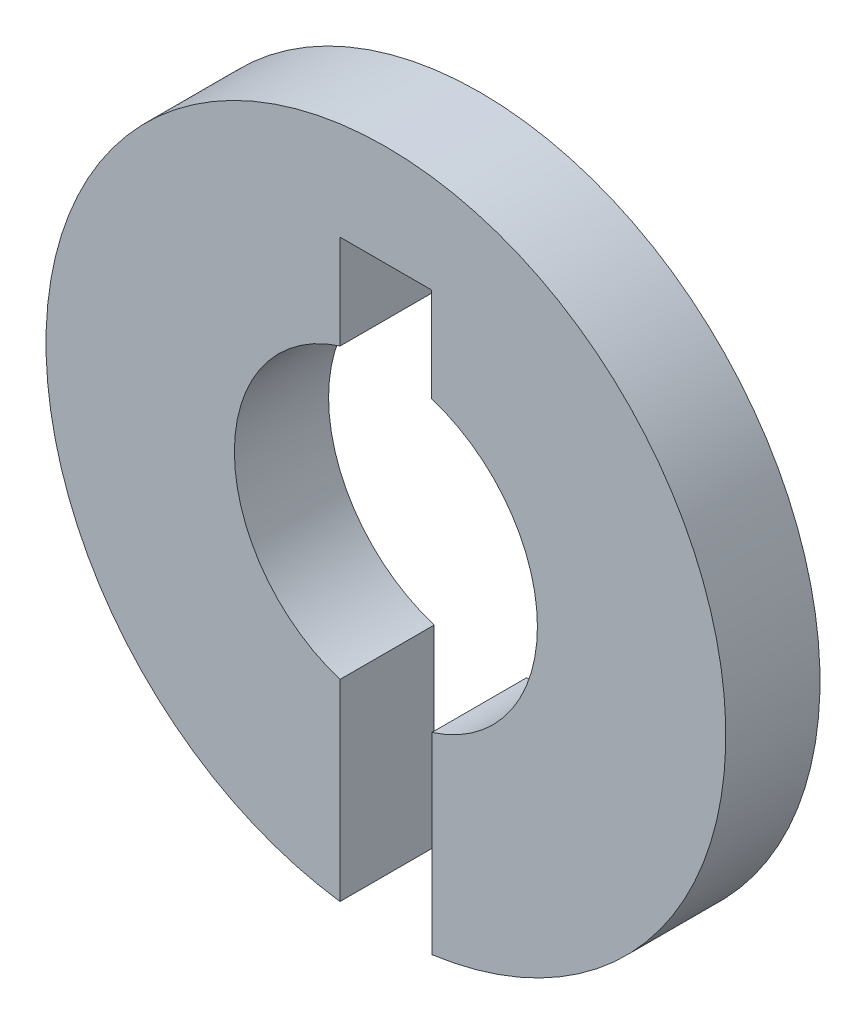
ISO-10303-21;
HEADER;
FILE_DESCRIPTION(('STEP AP214'),'2;1');
FILE_NAME('part.step','',(''),(''),'','','');
FILE_SCHEMA(('AUTOMOTIVE_DESIGN { 1 0 10303 214 1 1 1 1 }'));
ENDSEC;
DATA;
#1=APPLICATION_CONTEXT('core data for automotive mechanical design processes');
#2=APPLICATION_PROTOCOL_DEFINITION('international standard','automotive_design',2000,#1);
#3=PRODUCT_CONTEXT('',#1,'mechanical');
#4=PRODUCT('Part','Part','',(#3));
#5=PRODUCT_RELATED_PRODUCT_CATEGORY('part','',(#4));
#6=PRODUCT_DEFINITION_FORMATION('','',#4);
#7=PRODUCT_DEFINITION_CONTEXT('part definition',#1,'design');
#8=PRODUCT_DEFINITION('design','',#6,#7);
#9=PRODUCT_DEFINITION_SHAPE('','',#8);
#10=(LENGTH_UNIT() NAMED_UNIT(*) SI_UNIT(.MILLI.,.METRE.));
#11=(NAMED_UNIT(*) PLANE_ANGLE_UNIT() SI_UNIT($,.RADIAN.));
#12=(NAMED_UNIT(*) SI_UNIT($,.STERADIAN.) SOLID_ANGLE_UNIT());
#13=UNCERTAINTY_MEASURE_WITH_UNIT(LENGTH_MEASURE(1.E-05),#10,'distance_accuracy_value','');
#14=(GEOMETRIC_REPRESENTATION_CONTEXT(3) GLOBAL_UNCERTAINTY_ASSIGNED_CONTEXT((#13)) GLOBAL_UNIT_ASSIGNED_CONTEXT((#10,
#11,#12)) REPRESENTATION_CONTEXT('',''));
#15=CARTESIAN_POINT('',(0.,0.,0.));
#16=DIRECTION('',(0.,0.,1.));
#17=DIRECTION('',(1.,0.,0.));
#18=AXIS2_PLACEMENT_3D('',#15,#16,#17);
#19=CARTESIAN_POINT('',(0.,0.,3.));
#20=DIRECTION('',(0.,0.,-1.));
#21=DIRECTION('',(-1.,0.,0.));
#22=AXIS2_PLACEMENT_3D('',#19,#20,#21);
#23=CYLINDRICAL_SURFACE('',#22,4.826);
#24=CARTESIAN_POINT('',(0.,0.,0.));
#25=DIRECTION('',(0.,0.,-1.));
#26=DIRECTION('',(1.,0.,0.));
#27=AXIS2_PLACEMENT_3D('',#24,#25,#26);
#28=CIRCLE('',#27,4.826);
#29=CARTESIAN_POINT('',(1.455,4.60144010066414,0.));
#30=VERTEX_POINT('',#29);
#31=CARTESIAN_POINT('',(1.4625,-4.59906183367869,0.));
#32=VERTEX_POINT('',#31);
#33=EDGE_CURVE('E201',#30,#32,#28,.T.);
#34=ORIENTED_EDGE('',*,*,#33,.T.);
#35=DIRECTION('',(0.,0.,-1.));
#36=VECTOR('',#35,1.);
#37=CARTESIAN_POINT('',(1.4625,-4.59906183367869,3.));
#38=LINE('',#37,#36);
#39=CARTESIAN_POINT('',(1.4625,-4.59906183367869,3.));
#40=VERTEX_POINT('',#39);
#41=EDGE_CURVE('E12',#40,#32,#38,.T.);
#42=ORIENTED_EDGE('',*,*,#41,.F.);
#43=CARTESIAN_POINT('',(0.,0.,3.));
#44=DIRECTION('',(0.,0.,-1.));
#45=DIRECTION('',(1.,0.,0.));
#46=AXIS2_PLACEMENT_3D('',#43,#44,#45);
#47=CIRCLE('',#46,4.826);
#48=CARTESIAN_POINT('',(1.455,4.60144010066414,3.));
#49=VERTEX_POINT('',#48);
#50=EDGE_CURVE('E166',#49,#40,#47,.T.);
#51=ORIENTED_EDGE('',*,*,#50,.F.);
#52=DIRECTION('',(0.,0.,-1.));
#53=VECTOR('',#52,1.);
#54=CARTESIAN_POINT('',(1.455,4.60144010066414,3.));
#55=LINE('',#54,#53);
#56=EDGE_CURVE('E141',#49,#30,#55,.T.);
#57=ORIENTED_EDGE('',*,*,#56,.T.);
#58=EDGE_LOOP('',(#34,#42,#51,#57));
#59=FACE_BOUND('',#58,.T.);
#60=ADVANCED_FACE('F46',(#59),#23,.F.);
#61=CARTESIAN_POINT('',(1.4625,-10.7267595176735,3.));
#62=DIRECTION('',(1.,0.,0.));
#63=DIRECTION('',(0.,0.,-1.));
#64=AXIS2_PLACEMENT_3D('',#61,#62,#63);
#65=PLANE('',#64);
#66=DIRECTION('',(0.,-1.,0.));
#67=VECTOR('',#66,1.);
#68=CARTESIAN_POINT('',(1.4625,-10.7267595176735,0.));
#69=LINE('',#68,#67);
#70=CARTESIAN_POINT('',(1.4625,-10.7267595176735,0.));
#71=VERTEX_POINT('',#70);
#72=EDGE_CURVE('E195',#32,#71,#69,.T.);
#73=ORIENTED_EDGE('',*,*,#72,.T.);
#74=DIRECTION('',(0.,0.,-1.));
#75=VECTOR('',#74,1.);
#76=CARTESIAN_POINT('',(1.4625,-10.7267595176735,3.));
#77=LINE('',#76,#75);
#78=CARTESIAN_POINT('',(1.4625,-10.7267595176735,3.));
#79=VERTEX_POINT('',#78);
#80=EDGE_CURVE('E54',#79,#71,#77,.T.);
#81=ORIENTED_EDGE('',*,*,#80,.F.);
#82=DIRECTION('',(0.,-1.,0.));
#83=VECTOR('',#82,1.);
#84=CARTESIAN_POINT('',(1.4625,-10.7267595176735,3.));
#85=LINE('',#84,#83);
#86=EDGE_CURVE('E105',#40,#79,#85,.T.);
#87=ORIENTED_EDGE('',*,*,#86,.F.);
#88=ORIENTED_EDGE('',*,*,#41,.T.);
#89=EDGE_LOOP('',(#73,#81,#87,#88));
#90=FACE_BOUND('',#89,.T.);
#91=ADVANCED_FACE('F220',(#90),#65,.F.);
#92=CARTESIAN_POINT('',(0.,0.,3.));
#93=DIRECTION('',(0.,0.,-1.));
#94=DIRECTION('',(-1.,0.,0.));
#95=AXIS2_PLACEMENT_3D('',#92,#93,#94);
#96=CYLINDRICAL_SURFACE('',#95,10.826);
#97=CARTESIAN_POINT('',(0.,0.,0.));
#98=DIRECTION('',(0.,0.,1.));
#99=DIRECTION('',(-1.,0.,0.));
#100=AXIS2_PLACEMENT_3D('',#97,#98,#99);
#101=CIRCLE('',#100,10.826);
#102=CARTESIAN_POINT('',(-1.4625,-10.7267595176735,0.));
#103=VERTEX_POINT('',#102);
#104=EDGE_CURVE('E190',#71,#103,#101,.T.);
#105=ORIENTED_EDGE('',*,*,#104,.T.);
#106=DIRECTION('',(0.,0.,-1.));
#107=VECTOR('',#106,1.);
#108=CARTESIAN_POINT('',(-1.4625,-10.7267595176735,3.));
#109=LINE('',#108,#107);
#110=CARTESIAN_POINT('',(-1.4625,-10.7267595176735,3.));
#111=VERTEX_POINT('',#110);
#112=EDGE_CURVE('E182',#111,#103,#109,.T.);
#113=ORIENTED_EDGE('',*,*,#112,.F.);
#114=CARTESIAN_POINT('',(0.,0.,3.));
#115=DIRECTION('',(0.,0.,1.));
#116=DIRECTION('',(-1.,0.,0.));
#117=AXIS2_PLACEMENT_3D('',#114,#115,#116);
#118=CIRCLE('',#117,10.826);
#119=EDGE_CURVE('E158',#79,#111,#118,.T.);
#120=ORIENTED_EDGE('',*,*,#119,.F.);
#121=ORIENTED_EDGE('',*,*,#80,.T.);
#122=EDGE_LOOP('',(#105,#113,#120,#121));
#123=FACE_BOUND('',#122,.T.);
#124=ADVANCED_FACE('F188',(#123),#96,.T.);
#125=CARTESIAN_POINT('',(-1.4625,-10.7267595176735,3.));
#126=DIRECTION('',(-1.,0.,0.));
#127=DIRECTION('',(0.,0.,1.));
#128=AXIS2_PLACEMENT_3D('',#125,#126,#127);
#129=PLANE('',#128);
#130=DIRECTION('',(0.,1.,0.));
#131=VECTOR('',#130,1.);
#132=CARTESIAN_POINT('',(-1.4625,-10.7267595176735,0.));
#133=LINE('',#132,#131);
#134=CARTESIAN_POINT('',(-1.4625,-4.59906183367869,0.));
#135=VERTEX_POINT('',#134);
#136=EDGE_CURVE('E197',#103,#135,#133,.T.);
#137=ORIENTED_EDGE('',*,*,#136,.T.);
#138=DIRECTION('',(0.,0.,-1.));
#139=VECTOR('',#138,1.);
#140=CARTESIAN_POINT('',(-1.4625,-4.59906183367869,3.));
#141=LINE('',#140,#139);
#142=CARTESIAN_POINT('',(-1.4625,-4.59906183367869,3.));
#143=VERTEX_POINT('',#142);
#144=EDGE_CURVE('E179',#143,#135,#141,.T.);
#145=ORIENTED_EDGE('',*,*,#144,.F.);
#146=DIRECTION('',(0.,1.,0.));
#147=VECTOR('',#146,1.);
#148=CARTESIAN_POINT('',(-1.4625,-10.7267595176735,3.));
#149=LINE('',#148,#147);
#150=EDGE_CURVE('E154',#111,#143,#149,.T.);
#151=ORIENTED_EDGE('',*,*,#150,.F.);
#152=ORIENTED_EDGE('',*,*,#112,.T.);
#153=EDGE_LOOP('',(#137,#145,#151,#152));
#154=FACE_BOUND('',#153,.T.);
#155=ADVANCED_FACE('F227',(#154),#129,.F.);
#156=CARTESIAN_POINT('',(0.,0.,3.));
#157=DIRECTION('',(0.,0.,-1.));
#158=DIRECTION('',(-1.,0.,0.));
#159=AXIS2_PLACEMENT_3D('',#156,#157,#158);
#160=CYLINDRICAL_SURFACE('',#159,4.826);
#161=CARTESIAN_POINT('',(0.,0.,0.));
#162=DIRECTION('',(0.,0.,-1.));
#163=DIRECTION('',(1.,0.,0.));
#164=AXIS2_PLACEMENT_3D('',#161,#162,#163);
#165=CIRCLE('',#164,4.826);
#166=CARTESIAN_POINT('',(-1.455,4.60144010066414,0.));
#167=VERTEX_POINT('',#166);
#168=EDGE_CURVE('E199',#135,#167,#165,.T.);
#169=ORIENTED_EDGE('',*,*,#168,.T.);
#170=DIRECTION('',(0.,0.,-1.));
#171=VECTOR('',#170,1.);
#172=CARTESIAN_POINT('',(-1.455,4.60144010066414,3.));
#173=LINE('',#172,#171);
#174=CARTESIAN_POINT('',(-1.455,4.60144010066414,3.));
#175=VERTEX_POINT('',#174);
#176=EDGE_CURVE('E134',#175,#167,#173,.T.);
#177=ORIENTED_EDGE('',*,*,#176,.F.);
#178=CARTESIAN_POINT('',(0.,0.,3.));
#179=DIRECTION('',(0.,0.,-1.));
#180=DIRECTION('',(1.,0.,0.));
#181=AXIS2_PLACEMENT_3D('',#178,#179,#180);
#182=CIRCLE('',#181,4.826);
#183=EDGE_CURVE('E124',#143,#175,#182,.T.);
#184=ORIENTED_EDGE('',*,*,#183,.F.);
#185=ORIENTED_EDGE('',*,*,#144,.T.);
#186=EDGE_LOOP('',(#169,#177,#184,#185));
#187=FACE_BOUND('',#186,.T.);
#188=ADVANCED_FACE('F205',(#187),#160,.F.);
#189=CARTESIAN_POINT('',(-1.455,7.60144010066414,3.));
#190=DIRECTION('',(-1.,0.,0.));
#191=DIRECTION('',(0.,-1.,0.));
#192=AXIS2_PLACEMENT_3D('',#189,#190,#191);
#193=PLANE('',#192);
#194=DIRECTION('',(0.,1.,0.));
#195=VECTOR('',#194,1.);
#196=CARTESIAN_POINT('',(-1.455,7.60144010066414,0.));
#197=LINE('',#196,#195);
#198=CARTESIAN_POINT('',(-1.455,7.60144010066414,0.));
#199=VERTEX_POINT('',#198);
#200=EDGE_CURVE('E133',#167,#199,#197,.T.);
#201=ORIENTED_EDGE('',*,*,#200,.T.);
#202=DIRECTION('',(0.,0.,-1.));
#203=VECTOR('',#202,1.);
#204=CARTESIAN_POINT('',(-1.455,7.60144010066414,3.));
#205=LINE('',#204,#203);
#206=CARTESIAN_POINT('',(-1.455,7.60144010066414,3.));
#207=VERTEX_POINT('',#206);
#208=EDGE_CURVE('E130',#207,#199,#205,.T.);
#209=ORIENTED_EDGE('',*,*,#208,.F.);
#210=DIRECTION('',(0.,1.,0.));
#211=VECTOR('',#210,1.);
#212=CARTESIAN_POINT('',(-1.455,7.60144010066414,3.));
#213=LINE('',#212,#211);
#214=EDGE_CURVE('E118',#175,#207,#213,.T.);
#215=ORIENTED_EDGE('',*,*,#214,.F.);
#216=ORIENTED_EDGE('',*,*,#176,.T.);
#217=EDGE_LOOP('',(#201,#209,#215,#216));
#218=FACE_BOUND('',#217,.T.);
#219=ADVANCED_FACE('F131',(#218),#193,.F.);
#220=CARTESIAN_POINT('',(-1.455,7.60144010066414,3.));
#221=DIRECTION('',(0.,1.,0.));
#222=DIRECTION('',(0.,0.,1.));
#223=AXIS2_PLACEMENT_3D('',#220,#221,#222);
#224=PLANE('',#223);
#225=DIRECTION('',(1.,0.,0.));
#226=VECTOR('',#225,1.);
#227=CARTESIAN_POINT('',(-1.455,7.60144010066414,0.));
#228=LINE('',#227,#226);
#229=CARTESIAN_POINT('',(1.455,7.60144010066414,0.));
#230=VERTEX_POINT('',#229);
#231=EDGE_CURVE('E91',#199,#230,#228,.T.);
#232=ORIENTED_EDGE('',*,*,#231,.T.);
#233=DIRECTION('',(0.,0.,-1.));
#234=VECTOR('',#233,1.);
#235=CARTESIAN_POINT('',(1.455,7.60144010066414,3.));
#236=LINE('',#235,#234);
#237=CARTESIAN_POINT('',(1.455,7.60144010066414,3.));
#238=VERTEX_POINT('',#237);
#239=EDGE_CURVE('E135',#238,#230,#236,.T.);
#240=ORIENTED_EDGE('',*,*,#239,.F.);
#241=DIRECTION('',(1.,0.,0.));
#242=VECTOR('',#241,1.);
#243=CARTESIAN_POINT('',(-1.455,7.60144010066414,3.));
#244=LINE('',#243,#242);
#245=EDGE_CURVE('E122',#207,#238,#244,.T.);
#246=ORIENTED_EDGE('',*,*,#245,.F.);
#247=ORIENTED_EDGE('',*,*,#208,.T.);
#248=EDGE_LOOP('',(#232,#240,#246,#247));
#249=FACE_BOUND('',#248,.T.);
#250=ADVANCED_FACE('F137',(#249),#224,.F.);
#251=CARTESIAN_POINT('',(1.455,7.60144010066414,3.));
#252=DIRECTION('',(1.,0.,0.));
#253=DIRECTION('',(0.,1.,0.));
#254=AXIS2_PLACEMENT_3D('',#251,#252,#253);
#255=PLANE('',#254);
#256=DIRECTION('',(0.,-1.,0.));
#257=VECTOR('',#256,1.);
#258=CARTESIAN_POINT('',(1.455,7.60144010066414,0.));
#259=LINE('',#258,#257);
#260=EDGE_CURVE('E97',#230,#30,#259,.T.);
#261=ORIENTED_EDGE('',*,*,#260,.T.);
#262=ORIENTED_EDGE('',*,*,#56,.F.);
#263=DIRECTION('',(0.,-1.,0.));
#264=VECTOR('',#263,1.);
#265=CARTESIAN_POINT('',(1.455,7.60144010066414,3.));
#266=LINE('',#265,#264);
#267=EDGE_CURVE('E62',#238,#49,#266,.T.);
#268=ORIENTED_EDGE('',*,*,#267,.F.);
#269=ORIENTED_EDGE('',*,*,#239,.T.);
#270=EDGE_LOOP('',(#261,#262,#268,#269));
#271=FACE_BOUND('',#270,.T.);
#272=ADVANCED_FACE('F209',(#271),#255,.F.);
#273=CARTESIAN_POINT('',(0.,0.,3.));
#274=DIRECTION('',(0.,0.,1.));
#275=DIRECTION('',(1.,0.,0.));
#276=AXIS2_PLACEMENT_3D('',#273,#274,#275);
#277=PLANE('',#276);
#278=ORIENTED_EDGE('',*,*,#50,.T.);
#279=ORIENTED_EDGE('',*,*,#86,.T.);
#280=ORIENTED_EDGE('',*,*,#119,.T.);
#281=ORIENTED_EDGE('',*,*,#150,.T.);
#282=ORIENTED_EDGE('',*,*,#183,.T.);
#283=ORIENTED_EDGE('',*,*,#214,.T.);
#284=ORIENTED_EDGE('',*,*,#245,.T.);
#285=ORIENTED_EDGE('',*,*,#267,.T.);
#286=EDGE_LOOP('',(#278,#279,#280,#281,#282,#283,#284,#285));
#287=FACE_BOUND('',#286,.T.);
#288=ADVANCED_FACE('F120',(#287),#277,.T.);
#289=CARTESIAN_POINT('',(0.,0.,0.));
#290=DIRECTION('',(0.,0.,1.));
#291=DIRECTION('',(1.,0.,0.));
#292=AXIS2_PLACEMENT_3D('',#289,#290,#291);
#293=PLANE('',#292);
#294=ORIENTED_EDGE('',*,*,#33,.F.);
#295=ORIENTED_EDGE('',*,*,#260,.F.);
#296=ORIENTED_EDGE('',*,*,#231,.F.);
#297=ORIENTED_EDGE('',*,*,#200,.F.);
#298=ORIENTED_EDGE('',*,*,#168,.F.);
#299=ORIENTED_EDGE('',*,*,#136,.F.);
#300=ORIENTED_EDGE('',*,*,#104,.F.);
#301=ORIENTED_EDGE('',*,*,#72,.F.);
#302=EDGE_LOOP('',(#294,#295,#296,#297,#298,#299,#300,#301));
#303=FACE_BOUND('',#302,.T.);
#304=ADVANCED_FACE('F194',(#303),#293,.F.);
#305=CLOSED_SHELL('',(#60,#91,#124,#155,#188,#219,#250,#272,#288,#304));
#306=MANIFOLD_SOLID_BREP('B2',#305);
#307=ADVANCED_BREP_SHAPE_REPRESENTATION('',(#18,#306),#14);
#308=SHAPE_DEFINITION_REPRESENTATION(#9,#307);
ENDSEC;
END-ISO-10303-21;
